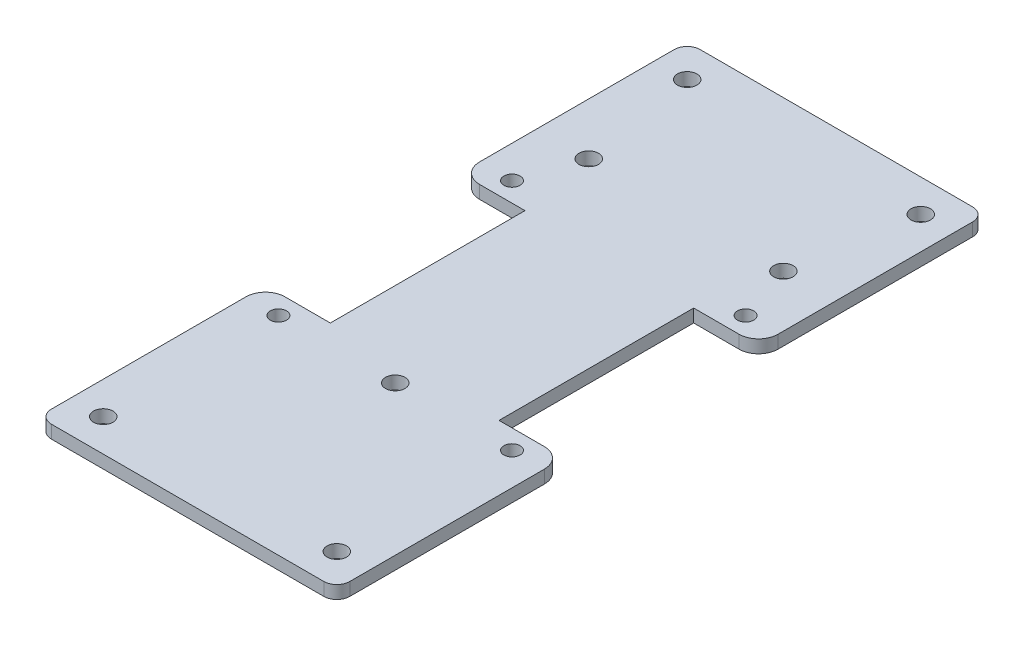
ISO-10303-21;
HEADER;
FILE_DESCRIPTION(('STEP AP214'),'2;1');
FILE_NAME('part.step','',(''),(''),'','','');
FILE_SCHEMA(('AUTOMOTIVE_DESIGN { 1 0 10303 214 1 1 1 1 }'));
ENDSEC;
DATA;
#1=APPLICATION_CONTEXT('core data for automotive mechanical design processes');
#2=APPLICATION_PROTOCOL_DEFINITION('international standard','automotive_design',2000,#1);
#3=PRODUCT_CONTEXT('',#1,'mechanical');
#4=PRODUCT('Part','Part','',(#3));
#5=PRODUCT_RELATED_PRODUCT_CATEGORY('part','',(#4));
#6=PRODUCT_DEFINITION_FORMATION('','',#4);
#7=PRODUCT_DEFINITION_CONTEXT('part definition',#1,'design');
#8=PRODUCT_DEFINITION('design','',#6,#7);
#9=PRODUCT_DEFINITION_SHAPE('','',#8);
#10=(LENGTH_UNIT() NAMED_UNIT(*) SI_UNIT(.MILLI.,.METRE.));
#11=(NAMED_UNIT(*) PLANE_ANGLE_UNIT() SI_UNIT($,.RADIAN.));
#12=(NAMED_UNIT(*) SI_UNIT($,.STERADIAN.) SOLID_ANGLE_UNIT());
#13=UNCERTAINTY_MEASURE_WITH_UNIT(LENGTH_MEASURE(1.E-05),#10,'distance_accuracy_value','');
#14=(GEOMETRIC_REPRESENTATION_CONTEXT(3) GLOBAL_UNCERTAINTY_ASSIGNED_CONTEXT((#13)) GLOBAL_UNIT_ASSIGNED_CONTEXT((#10,
#11,#12)) REPRESENTATION_CONTEXT('',''));
#15=CARTESIAN_POINT('',(0.,0.,0.));
#16=DIRECTION('',(0.,0.,1.));
#17=DIRECTION('',(1.,0.,0.));
#18=AXIS2_PLACEMENT_3D('',#15,#16,#17);
#19=CARTESIAN_POINT('',(-5.,2.,32.));
#20=DIRECTION('',(1.,0.,0.));
#21=DIRECTION('',(0.,0.,-1.));
#22=AXIS2_PLACEMENT_3D('',#19,#20,#21);
#23=PLANE('',#22);
#24=DIRECTION('',(0.,0.,1.));
#25=VECTOR('',#24,1.);
#26=CARTESIAN_POINT('',(-5.,0.,32.));
#27=LINE('',#26,#25);
#28=CARTESIAN_POINT('',(-5.,0.,-66.));
#29=VERTEX_POINT('',#28);
#30=CARTESIAN_POINT('',(-5.,0.,-36.));
#31=VERTEX_POINT('',#30);
#32=EDGE_CURVE('E311',#29,#31,#27,.T.);
#33=ORIENTED_EDGE('',*,*,#32,.T.);
#34=DIRECTION('',(0.,1.,0.));
#35=VECTOR('',#34,1.);
#36=CARTESIAN_POINT('',(-5.,2.,-36.));
#37=LINE('',#36,#35);
#38=CARTESIAN_POINT('',(-5.,2.,-36.));
#39=VERTEX_POINT('',#38);
#40=EDGE_CURVE('E46',#31,#39,#37,.T.);
#41=ORIENTED_EDGE('',*,*,#40,.T.);
#42=DIRECTION('',(0.,0.,1.));
#43=VECTOR('',#42,1.);
#44=CARTESIAN_POINT('',(-5.,2.,32.));
#45=LINE('',#44,#43);
#46=CARTESIAN_POINT('',(-5.,2.,-66.));
#47=VERTEX_POINT('',#46);
#48=EDGE_CURVE('E296',#47,#39,#45,.T.);
#49=ORIENTED_EDGE('',*,*,#48,.F.);
#50=DIRECTION('',(0.,-1.,0.));
#51=VECTOR('',#50,1.);
#52=CARTESIAN_POINT('',(-5.,2.,-66.));
#53=LINE('',#52,#51);
#54=EDGE_CURVE('E338',#47,#29,#53,.T.);
#55=ORIENTED_EDGE('',*,*,#54,.T.);
#56=EDGE_LOOP('',(#33,#41,#49,#55));
#57=FACE_BOUND('',#56,.T.);
#58=ADVANCED_FACE('F38',(#57),#23,.F.);
#59=CARTESIAN_POINT('',(41.,2.,32.));
#60=DIRECTION('',(-1.,0.,0.));
#61=DIRECTION('',(0.,0.,1.));
#62=AXIS2_PLACEMENT_3D('',#59,#60,#61);
#63=PLANE('',#62);
#64=DIRECTION('',(0.,0.,-1.));
#65=VECTOR('',#64,1.);
#66=CARTESIAN_POINT('',(41.,2.,32.));
#67=LINE('',#66,#65);
#68=CARTESIAN_POINT('',(41.,2.,-36.));
#69=VERTEX_POINT('',#68);
#70=CARTESIAN_POINT('',(41.,2.,-66.));
#71=VERTEX_POINT('',#70);
#72=EDGE_CURVE('E303',#69,#71,#67,.T.);
#73=ORIENTED_EDGE('',*,*,#72,.F.);
#74=DIRECTION('',(0.,1.,0.));
#75=VECTOR('',#74,1.);
#76=CARTESIAN_POINT('',(41.,2.,-36.));
#77=LINE('',#76,#75);
#78=CARTESIAN_POINT('',(41.,0.,-36.));
#79=VERTEX_POINT('',#78);
#80=EDGE_CURVE('E374',#69,#79,#77,.F.);
#81=ORIENTED_EDGE('',*,*,#80,.T.);
#82=DIRECTION('',(0.,0.,-1.));
#83=VECTOR('',#82,1.);
#84=CARTESIAN_POINT('',(41.,0.,32.));
#85=LINE('',#84,#83);
#86=CARTESIAN_POINT('',(41.,0.,-66.));
#87=VERTEX_POINT('',#86);
#88=EDGE_CURVE('E317',#79,#87,#85,.T.);
#89=ORIENTED_EDGE('',*,*,#88,.T.);
#90=DIRECTION('',(0.,-1.,0.));
#91=VECTOR('',#90,1.);
#92=CARTESIAN_POINT('',(41.,2.,-66.));
#93=LINE('',#92,#91);
#94=EDGE_CURVE('E352',#87,#71,#93,.F.);
#95=ORIENTED_EDGE('',*,*,#94,.T.);
#96=EDGE_LOOP('',(#73,#81,#89,#95));
#97=FACE_BOUND('',#96,.T.);
#98=ADVANCED_FACE('F427',(#97),#63,.F.);
#99=CARTESIAN_POINT('',(0.,2.,0.));
#100=DIRECTION('',(0.,-1.,0.));
#101=DIRECTION('',(0.,0.,-1.));
#102=AXIS2_PLACEMENT_3D('',#99,#100,#101);
#103=PLANE('',#102);
#104=DIRECTION('',(-1.,0.,0.));
#105=VECTOR('',#104,1.);
#106=CARTESIAN_POINT('',(41.,2.,-33.));
#107=LINE('',#106,#105);
#108=CARTESIAN_POINT('',(38.,2.,-33.));
#109=VERTEX_POINT('',#108);
#110=CARTESIAN_POINT('',(31.,2.,-33.));
#111=VERTEX_POINT('',#110);
#112=EDGE_CURVE('E214',#109,#111,#107,.T.);
#113=ORIENTED_EDGE('',*,*,#112,.F.);
#114=CARTESIAN_POINT('',(38.,2.,-36.));
#115=DIRECTION('',(0.,-1.,0.));
#116=DIRECTION('',(0.,0.,-1.));
#117=AXIS2_PLACEMENT_3D('',#114,#115,#116);
#118=CIRCLE('',#117,3.);
#119=EDGE_CURVE('E372',#109,#69,#118,.F.);
#120=ORIENTED_EDGE('',*,*,#119,.T.);
#121=ORIENTED_EDGE('',*,*,#72,.T.);
#122=CARTESIAN_POINT('',(39.,2.,-66.));
#123=DIRECTION('',(0.,-1.,0.));
#124=DIRECTION('',(0.,0.,-1.));
#125=AXIS2_PLACEMENT_3D('',#122,#123,#124);
#126=CIRCLE('',#125,2.);
#127=CARTESIAN_POINT('',(39.,2.,-68.));
#128=VERTEX_POINT('',#127);
#129=EDGE_CURVE('E344',#71,#128,#126,.F.);
#130=ORIENTED_EDGE('',*,*,#129,.T.);
#131=DIRECTION('',(-1.,0.,0.));
#132=VECTOR('',#131,1.);
#133=CARTESIAN_POINT('',(-5.,2.,-68.));
#134=LINE('',#133,#132);
#135=CARTESIAN_POINT('',(-3.,2.,-68.));
#136=VERTEX_POINT('',#135);
#137=EDGE_CURVE('E307',#128,#136,#134,.T.);
#138=ORIENTED_EDGE('',*,*,#137,.T.);
#139=CARTESIAN_POINT('',(-3.,2.,-66.));
#140=DIRECTION('',(0.,-1.,0.));
#141=DIRECTION('',(0.,0.,-1.));
#142=AXIS2_PLACEMENT_3D('',#139,#140,#141);
#143=CIRCLE('',#142,2.);
#144=EDGE_CURVE('E346',#136,#47,#143,.F.);
#145=ORIENTED_EDGE('',*,*,#144,.T.);
#146=ORIENTED_EDGE('',*,*,#48,.T.);
#147=CARTESIAN_POINT('',(-2.,2.,-36.));
#148=DIRECTION('',(0.,-1.,0.));
#149=DIRECTION('',(0.,0.,-1.));
#150=AXIS2_PLACEMENT_3D('',#147,#148,#149);
#151=CIRCLE('',#150,3.);
#152=CARTESIAN_POINT('',(-2.,2.,-33.));
#153=VERTEX_POINT('',#152);
#154=EDGE_CURVE('E366',#39,#153,#151,.F.);
#155=ORIENTED_EDGE('',*,*,#154,.T.);
#156=DIRECTION('',(-1.,0.,0.));
#157=VECTOR('',#156,1.);
#158=CARTESIAN_POINT('',(-5.,2.,-33.));
#159=LINE('',#158,#157);
#160=CARTESIAN_POINT('',(5.,2.,-33.));
#161=VERTEX_POINT('',#160);
#162=EDGE_CURVE('E184',#161,#153,#159,.T.);
#163=ORIENTED_EDGE('',*,*,#162,.F.);
#164=DIRECTION('',(0.,0.,-1.));
#165=VECTOR('',#164,1.);
#166=CARTESIAN_POINT('',(5.,2.,-33.));
#167=LINE('',#166,#165);
#168=CARTESIAN_POINT('',(5.,2.,-3.));
#169=VERTEX_POINT('',#168);
#170=EDGE_CURVE('E203',#169,#161,#167,.T.);
#171=ORIENTED_EDGE('',*,*,#170,.F.);
#172=DIRECTION('',(1.,0.,0.));
#173=VECTOR('',#172,1.);
#174=CARTESIAN_POINT('',(5.,2.,-3.));
#175=LINE('',#174,#173);
#176=CARTESIAN_POINT('',(-2.,2.,-3.));
#177=VERTEX_POINT('',#176);
#178=EDGE_CURVE('E190',#177,#169,#175,.T.);
#179=ORIENTED_EDGE('',*,*,#178,.F.);
#180=CARTESIAN_POINT('',(-2.,2.,0.));
#181=DIRECTION('',(0.,-1.,0.));
#182=DIRECTION('',(0.,0.,-1.));
#183=AXIS2_PLACEMENT_3D('',#180,#181,#182);
#184=CIRCLE('',#183,3.);
#185=CARTESIAN_POINT('',(-5.,2.,0.));
#186=VERTEX_POINT('',#185);
#187=EDGE_CURVE('E368',#177,#186,#184,.F.);
#188=ORIENTED_EDGE('',*,*,#187,.T.);
#189=CARTESIAN_POINT('',(-5.,2.,30.));
#190=VERTEX_POINT('',#189);
#191=EDGE_CURVE('E300',#186,#190,#45,.T.);
#192=ORIENTED_EDGE('',*,*,#191,.T.);
#193=CARTESIAN_POINT('',(-3.,2.,30.));
#194=DIRECTION('',(0.,-1.,0.));
#195=DIRECTION('',(0.,0.,-1.));
#196=AXIS2_PLACEMENT_3D('',#193,#194,#195);
#197=CIRCLE('',#196,2.);
#198=CARTESIAN_POINT('',(-3.,2.,32.));
#199=VERTEX_POINT('',#198);
#200=EDGE_CURVE('E350',#190,#199,#197,.F.);
#201=ORIENTED_EDGE('',*,*,#200,.T.);
#202=DIRECTION('',(1.,0.,0.));
#203=VECTOR('',#202,1.);
#204=CARTESIAN_POINT('',(-5.,2.,32.));
#205=LINE('',#204,#203);
#206=CARTESIAN_POINT('',(39.,2.,32.));
#207=VERTEX_POINT('',#206);
#208=EDGE_CURVE('E299',#199,#207,#205,.T.);
#209=ORIENTED_EDGE('',*,*,#208,.T.);
#210=CARTESIAN_POINT('',(39.,2.,30.));
#211=DIRECTION('',(0.,-1.,0.));
#212=DIRECTION('',(0.,0.,-1.));
#213=AXIS2_PLACEMENT_3D('',#210,#211,#212);
#214=CIRCLE('',#213,2.);
#215=CARTESIAN_POINT('',(41.,2.,30.));
#216=VERTEX_POINT('',#215);
#217=EDGE_CURVE('E348',#207,#216,#214,.F.);
#218=ORIENTED_EDGE('',*,*,#217,.T.);
#219=CARTESIAN_POINT('',(41.,2.,0.));
#220=VERTEX_POINT('',#219);
#221=EDGE_CURVE('E304',#216,#220,#67,.T.);
#222=ORIENTED_EDGE('',*,*,#221,.T.);
#223=CARTESIAN_POINT('',(38.,2.,0.));
#224=DIRECTION('',(0.,-1.,0.));
#225=DIRECTION('',(0.,0.,-1.));
#226=AXIS2_PLACEMENT_3D('',#223,#224,#225);
#227=CIRCLE('',#226,3.);
#228=CARTESIAN_POINT('',(38.,2.,-3.00000000000001));
#229=VERTEX_POINT('',#228);
#230=EDGE_CURVE('E370',#220,#229,#227,.F.);
#231=ORIENTED_EDGE('',*,*,#230,.T.);
#232=DIRECTION('',(1.,0.,0.));
#233=VECTOR('',#232,1.);
#234=CARTESIAN_POINT('',(31.,2.,-3.00000000000001));
#235=LINE('',#234,#233);
#236=CARTESIAN_POINT('',(31.,2.,-3.00000000000001));
#237=VERTEX_POINT('',#236);
#238=EDGE_CURVE('E223',#237,#229,#235,.T.);
#239=ORIENTED_EDGE('',*,*,#238,.F.);
#240=DIRECTION('',(0.,0.,1.));
#241=VECTOR('',#240,1.);
#242=CARTESIAN_POINT('',(31.,2.,-33.));
#243=LINE('',#242,#241);
#244=EDGE_CURVE('E220',#111,#237,#243,.T.);
#245=ORIENTED_EDGE('',*,*,#244,.F.);
#246=EDGE_LOOP('',(#113,#120,#121,#130,#138,#145,#146,#155,#163,#171,#179,#188,#192,#201,#209,
#218,#222,#231,#239,#245));
#247=FACE_BOUND('',#246,.T.);
#248=CARTESIAN_POINT('',(0.,2.,-36.));
#249=DIRECTION('',(0.,1.,0.));
#250=DIRECTION('',(0.,0.,1.));
#251=AXIS2_PLACEMENT_3D('',#248,#249,#250);
#252=CIRCLE('',#251,1.25);
#253=CARTESIAN_POINT('',(0.,2.,-34.75));
#254=VERTEX_POINT('',#253);
#255=EDGE_CURVE('E290',#254,#254,#252,.T.);
#256=ORIENTED_EDGE('',*,*,#255,.F.);
#257=EDGE_LOOP('',(#256));
#258=FACE_BOUND('',#257,.T.);
#259=CARTESIAN_POINT('',(36.,2.,-36.));
#260=DIRECTION('',(0.,1.,0.));
#261=DIRECTION('',(0.,0.,1.));
#262=AXIS2_PLACEMENT_3D('',#259,#260,#261);
#263=CIRCLE('',#262,1.25);
#264=CARTESIAN_POINT('',(36.,2.,-34.75));
#265=VERTEX_POINT('',#264);
#266=EDGE_CURVE('E284',#265,#265,#263,.T.);
#267=ORIENTED_EDGE('',*,*,#266,.F.);
#268=EDGE_LOOP('',(#267));
#269=FACE_BOUND('',#268,.T.);
#270=CARTESIAN_POINT('',(0.,2.,0.));
#271=DIRECTION('',(0.,1.,0.));
#272=DIRECTION('',(0.,0.,1.));
#273=AXIS2_PLACEMENT_3D('',#270,#271,#272);
#274=CIRCLE('',#273,1.25);
#275=CARTESIAN_POINT('',(0.,2.,1.25));
#276=VERTEX_POINT('',#275);
#277=EDGE_CURVE('E278',#276,#276,#274,.T.);
#278=ORIENTED_EDGE('',*,*,#277,.F.);
#279=EDGE_LOOP('',(#278));
#280=FACE_BOUND('',#279,.T.);
#281=CARTESIAN_POINT('',(36.,2.,0.));
#282=DIRECTION('',(0.,1.,0.));
#283=DIRECTION('',(0.,0.,1.));
#284=AXIS2_PLACEMENT_3D('',#281,#282,#283);
#285=CIRCLE('',#284,1.25);
#286=CARTESIAN_POINT('',(36.,2.,1.25));
#287=VERTEX_POINT('',#286);
#288=EDGE_CURVE('E272',#287,#287,#285,.T.);
#289=ORIENTED_EDGE('',*,*,#288,.F.);
#290=EDGE_LOOP('',(#289));
#291=FACE_BOUND('',#290,.T.);
#292=CARTESIAN_POINT('',(0.,2.,-63.));
#293=DIRECTION('',(0.,1.,0.));
#294=DIRECTION('',(0.,0.,1.));
#295=AXIS2_PLACEMENT_3D('',#292,#293,#294);
#296=CIRCLE('',#295,1.5);
#297=CARTESIAN_POINT('',(0.,2.,-61.5));
#298=VERTEX_POINT('',#297);
#299=EDGE_CURVE('E266',#298,#298,#296,.T.);
#300=ORIENTED_EDGE('',*,*,#299,.F.);
#301=EDGE_LOOP('',(#300));
#302=FACE_BOUND('',#301,.T.);
#303=CARTESIAN_POINT('',(36.,2.,-63.));
#304=DIRECTION('',(0.,1.,0.));
#305=DIRECTION('',(0.,0.,1.));
#306=AXIS2_PLACEMENT_3D('',#303,#304,#305);
#307=CIRCLE('',#306,1.5);
#308=CARTESIAN_POINT('',(36.,2.,-61.5));
#309=VERTEX_POINT('',#308);
#310=EDGE_CURVE('E260',#309,#309,#307,.T.);
#311=ORIENTED_EDGE('',*,*,#310,.F.);
#312=EDGE_LOOP('',(#311));
#313=FACE_BOUND('',#312,.T.);
#314=CARTESIAN_POINT('',(36.,2.,27.));
#315=DIRECTION('',(0.,1.,0.));
#316=DIRECTION('',(0.,0.,-1.));
#317=AXIS2_PLACEMENT_3D('',#314,#315,#316);
#318=CIRCLE('',#317,1.5);
#319=CARTESIAN_POINT('',(36.,2.,25.5));
#320=VERTEX_POINT('',#319);
#321=EDGE_CURVE('E254',#320,#320,#318,.T.);
#322=ORIENTED_EDGE('',*,*,#321,.F.);
#323=EDGE_LOOP('',(#322));
#324=FACE_BOUND('',#323,.T.);
#325=CARTESIAN_POINT('',(0.,2.,27.));
#326=DIRECTION('',(0.,1.,0.));
#327=DIRECTION('',(0.,0.,-1.));
#328=AXIS2_PLACEMENT_3D('',#325,#326,#327);
#329=CIRCLE('',#328,1.5);
#330=CARTESIAN_POINT('',(0.,2.,25.5));
#331=VERTEX_POINT('',#330);
#332=EDGE_CURVE('E248',#331,#331,#329,.T.);
#333=ORIENTED_EDGE('',*,*,#332,.F.);
#334=EDGE_LOOP('',(#333));
#335=FACE_BOUND('',#334,.T.);
#336=CARTESIAN_POINT('',(3.,2.,-44.83));
#337=DIRECTION('',(0.,1.,0.));
#338=DIRECTION('',(0.,0.,1.));
#339=AXIS2_PLACEMENT_3D('',#336,#337,#338);
#340=CIRCLE('',#339,1.5);
#341=CARTESIAN_POINT('',(3.,2.,-43.33));
#342=VERTEX_POINT('',#341);
#343=EDGE_CURVE('E242',#342,#342,#340,.T.);
#344=ORIENTED_EDGE('',*,*,#343,.F.);
#345=EDGE_LOOP('',(#344));
#346=FACE_BOUND('',#345,.T.);
#347=CARTESIAN_POINT('',(33.,2.,-44.83));
#348=DIRECTION('',(0.,1.,0.));
#349=DIRECTION('',(0.,0.,1.));
#350=AXIS2_PLACEMENT_3D('',#347,#348,#349);
#351=CIRCLE('',#350,1.5);
#352=CARTESIAN_POINT('',(33.,2.,-43.33));
#353=VERTEX_POINT('',#352);
#354=EDGE_CURVE('E236',#353,#353,#351,.T.);
#355=ORIENTED_EDGE('',*,*,#354,.F.);
#356=EDGE_LOOP('',(#355));
#357=FACE_BOUND('',#356,.T.);
#358=CARTESIAN_POINT('',(18.,2.,0.));
#359=DIRECTION('',(0.,1.,0.));
#360=DIRECTION('',(0.,0.,1.));
#361=AXIS2_PLACEMENT_3D('',#358,#359,#360);
#362=CIRCLE('',#361,1.5);
#363=CARTESIAN_POINT('',(18.,2.,1.5));
#364=VERTEX_POINT('',#363);
#365=EDGE_CURVE('E230',#364,#364,#362,.T.);
#366=ORIENTED_EDGE('',*,*,#365,.F.);
#367=EDGE_LOOP('',(#366));
#368=FACE_BOUND('',#367,.T.);
#369=ADVANCED_FACE('F400',(#247,#258,#269,#280,#291,#302,#313,#324,#335,#346,#357,#368),#103,.F.);
#370=CARTESIAN_POINT('',(0.,0.,0.));
#371=DIRECTION('',(0.,-1.,0.));
#372=DIRECTION('',(0.,0.,-1.));
#373=AXIS2_PLACEMENT_3D('',#370,#371,#372);
#374=PLANE('',#373);
#375=ORIENTED_EDGE('',*,*,#88,.F.);
#376=CARTESIAN_POINT('',(38.,0.,-36.));
#377=DIRECTION('',(0.,-1.,0.));
#378=DIRECTION('',(0.,0.,-1.));
#379=AXIS2_PLACEMENT_3D('',#376,#377,#378);
#380=CIRCLE('',#379,3.);
#381=CARTESIAN_POINT('',(38.,0.,-33.));
#382=VERTEX_POINT('',#381);
#383=EDGE_CURVE('E381',#79,#382,#380,.T.);
#384=ORIENTED_EDGE('',*,*,#383,.T.);
#385=DIRECTION('',(-1.,0.,0.));
#386=VECTOR('',#385,1.);
#387=CARTESIAN_POINT('',(41.,0.,-33.));
#388=LINE('',#387,#386);
#389=CARTESIAN_POINT('',(31.,0.,-33.));
#390=VERTEX_POINT('',#389);
#391=EDGE_CURVE('E217',#382,#390,#388,.T.);
#392=ORIENTED_EDGE('',*,*,#391,.T.);
#393=DIRECTION('',(0.,0.,1.));
#394=VECTOR('',#393,1.);
#395=CARTESIAN_POINT('',(31.,0.,-33.));
#396=LINE('',#395,#394);
#397=CARTESIAN_POINT('',(31.,0.,-3.00000000000001));
#398=VERTEX_POINT('',#397);
#399=EDGE_CURVE('E210',#390,#398,#396,.T.);
#400=ORIENTED_EDGE('',*,*,#399,.T.);
#401=DIRECTION('',(1.,0.,0.));
#402=VECTOR('',#401,1.);
#403=CARTESIAN_POINT('',(31.,0.,-3.00000000000001));
#404=LINE('',#403,#402);
#405=CARTESIAN_POINT('',(38.,0.,-3.00000000000001));
#406=VERTEX_POINT('',#405);
#407=EDGE_CURVE('E213',#398,#406,#404,.T.);
#408=ORIENTED_EDGE('',*,*,#407,.T.);
#409=CARTESIAN_POINT('',(38.,0.,0.));
#410=DIRECTION('',(0.,-1.,0.));
#411=DIRECTION('',(0.,0.,-1.));
#412=AXIS2_PLACEMENT_3D('',#409,#410,#411);
#413=CIRCLE('',#412,3.);
#414=CARTESIAN_POINT('',(41.,0.,0.));
#415=VERTEX_POINT('',#414);
#416=EDGE_CURVE('E379',#406,#415,#413,.T.);
#417=ORIENTED_EDGE('',*,*,#416,.T.);
#418=CARTESIAN_POINT('',(41.,0.,30.));
#419=VERTEX_POINT('',#418);
#420=EDGE_CURVE('E318',#419,#415,#85,.T.);
#421=ORIENTED_EDGE('',*,*,#420,.F.);
#422=CARTESIAN_POINT('',(39.,0.,30.));
#423=DIRECTION('',(0.,-1.,0.));
#424=DIRECTION('',(0.,0.,-1.));
#425=AXIS2_PLACEMENT_3D('',#422,#423,#424);
#426=CIRCLE('',#425,2.);
#427=CARTESIAN_POINT('',(39.,0.,32.));
#428=VERTEX_POINT('',#427);
#429=EDGE_CURVE('E333',#419,#428,#426,.T.);
#430=ORIENTED_EDGE('',*,*,#429,.T.);
#431=DIRECTION('',(1.,0.,0.));
#432=VECTOR('',#431,1.);
#433=CARTESIAN_POINT('',(-5.,0.,32.));
#434=LINE('',#433,#432);
#435=CARTESIAN_POINT('',(-3.,0.,32.));
#436=VERTEX_POINT('',#435);
#437=EDGE_CURVE('E314',#436,#428,#434,.T.);
#438=ORIENTED_EDGE('',*,*,#437,.F.);
#439=CARTESIAN_POINT('',(-3.,0.,30.));
#440=DIRECTION('',(0.,-1.,0.));
#441=DIRECTION('',(0.,0.,-1.));
#442=AXIS2_PLACEMENT_3D('',#439,#440,#441);
#443=CIRCLE('',#442,2.);
#444=CARTESIAN_POINT('',(-5.,0.,30.));
#445=VERTEX_POINT('',#444);
#446=EDGE_CURVE('E335',#436,#445,#443,.T.);
#447=ORIENTED_EDGE('',*,*,#446,.T.);
#448=CARTESIAN_POINT('',(-5.,0.,0.));
#449=VERTEX_POINT('',#448);
#450=EDGE_CURVE('E293',#449,#445,#27,.T.);
#451=ORIENTED_EDGE('',*,*,#450,.F.);
#452=CARTESIAN_POINT('',(-2.,0.,0.));
#453=DIRECTION('',(0.,-1.,0.));
#454=DIRECTION('',(0.,0.,-1.));
#455=AXIS2_PLACEMENT_3D('',#452,#453,#454);
#456=CIRCLE('',#455,3.);
#457=CARTESIAN_POINT('',(-2.,0.,-3.));
#458=VERTEX_POINT('',#457);
#459=EDGE_CURVE('E53',#449,#458,#456,.T.);
#460=ORIENTED_EDGE('',*,*,#459,.T.);
#461=DIRECTION('',(1.,0.,0.));
#462=VECTOR('',#461,1.);
#463=CARTESIAN_POINT('',(5.,0.,-3.));
#464=LINE('',#463,#462);
#465=CARTESIAN_POINT('',(5.,0.,-3.));
#466=VERTEX_POINT('',#465);
#467=EDGE_CURVE('E173',#458,#466,#464,.T.);
#468=ORIENTED_EDGE('',*,*,#467,.T.);
#469=DIRECTION('',(0.,0.,-1.));
#470=VECTOR('',#469,1.);
#471=CARTESIAN_POINT('',(5.,0.,-33.));
#472=LINE('',#471,#470);
#473=CARTESIAN_POINT('',(5.,0.,-33.));
#474=VERTEX_POINT('',#473);
#475=EDGE_CURVE('E180',#466,#474,#472,.T.);
#476=ORIENTED_EDGE('',*,*,#475,.T.);
#477=DIRECTION('',(-1.,0.,0.));
#478=VECTOR('',#477,1.);
#479=CARTESIAN_POINT('',(-5.,0.,-33.));
#480=LINE('',#479,#478);
#481=CARTESIAN_POINT('',(-2.,0.,-33.));
#482=VERTEX_POINT('',#481);
#483=EDGE_CURVE('E195',#474,#482,#480,.T.);
#484=ORIENTED_EDGE('',*,*,#483,.T.);
#485=CARTESIAN_POINT('',(-2.,0.,-36.));
#486=DIRECTION('',(0.,-1.,0.));
#487=DIRECTION('',(0.,0.,-1.));
#488=AXIS2_PLACEMENT_3D('',#485,#486,#487);
#489=CIRCLE('',#488,3.);
#490=EDGE_CURVE('E376',#482,#31,#489,.T.);
#491=ORIENTED_EDGE('',*,*,#490,.T.);
#492=ORIENTED_EDGE('',*,*,#32,.F.);
#493=CARTESIAN_POINT('',(-3.,0.,-66.));
#494=DIRECTION('',(0.,-1.,0.));
#495=DIRECTION('',(0.,0.,-1.));
#496=AXIS2_PLACEMENT_3D('',#493,#494,#495);
#497=CIRCLE('',#496,2.);
#498=CARTESIAN_POINT('',(-3.,0.,-68.));
#499=VERTEX_POINT('',#498);
#500=EDGE_CURVE('E331',#29,#499,#497,.T.);
#501=ORIENTED_EDGE('',*,*,#500,.T.);
#502=DIRECTION('',(-1.,0.,0.));
#503=VECTOR('',#502,1.);
#504=CARTESIAN_POINT('',(-5.,0.,-68.));
#505=LINE('',#504,#503);
#506=CARTESIAN_POINT('',(39.,0.,-68.));
#507=VERTEX_POINT('',#506);
#508=EDGE_CURVE('E321',#507,#499,#505,.T.);
#509=ORIENTED_EDGE('',*,*,#508,.F.);
#510=CARTESIAN_POINT('',(39.,0.,-66.));
#511=DIRECTION('',(0.,-1.,0.));
#512=DIRECTION('',(0.,0.,-1.));
#513=AXIS2_PLACEMENT_3D('',#510,#511,#512);
#514=CIRCLE('',#513,2.);
#515=EDGE_CURVE('E328',#507,#87,#514,.T.);
#516=ORIENTED_EDGE('',*,*,#515,.T.);
#517=EDGE_LOOP('',(#375,#384,#392,#400,#408,#417,#421,#430,#438,#447,#451,#460,#468,#476,#484,
#491,#492,#501,#509,#516));
#518=FACE_BOUND('',#517,.T.);
#519=CARTESIAN_POINT('',(33.,0.,-44.83));
#520=DIRECTION('',(0.,1.,0.));
#521=DIRECTION('',(0.,0.,1.));
#522=AXIS2_PLACEMENT_3D('',#519,#520,#521);
#523=CIRCLE('',#522,1.5);
#524=CARTESIAN_POINT('',(33.,0.,-43.33));
#525=VERTEX_POINT('',#524);
#526=EDGE_CURVE('E233',#525,#525,#523,.T.);
#527=ORIENTED_EDGE('',*,*,#526,.T.);
#528=EDGE_LOOP('',(#527));
#529=FACE_BOUND('',#528,.T.);
#530=CARTESIAN_POINT('',(0.,0.,27.));
#531=DIRECTION('',(0.,1.,0.));
#532=DIRECTION('',(0.,0.,-1.));
#533=AXIS2_PLACEMENT_3D('',#530,#531,#532);
#534=CIRCLE('',#533,1.5);
#535=CARTESIAN_POINT('',(0.,0.,25.5));
#536=VERTEX_POINT('',#535);
#537=EDGE_CURVE('E245',#536,#536,#534,.T.);
#538=ORIENTED_EDGE('',*,*,#537,.T.);
#539=EDGE_LOOP('',(#538));
#540=FACE_BOUND('',#539,.T.);
#541=CARTESIAN_POINT('',(36.,0.,-63.));
#542=DIRECTION('',(0.,1.,0.));
#543=DIRECTION('',(0.,0.,1.));
#544=AXIS2_PLACEMENT_3D('',#541,#542,#543);
#545=CIRCLE('',#544,1.5);
#546=CARTESIAN_POINT('',(36.,0.,-61.5));
#547=VERTEX_POINT('',#546);
#548=EDGE_CURVE('E257',#547,#547,#545,.T.);
#549=ORIENTED_EDGE('',*,*,#548,.T.);
#550=EDGE_LOOP('',(#549));
#551=FACE_BOUND('',#550,.T.);
#552=CARTESIAN_POINT('',(36.,0.,0.));
#553=DIRECTION('',(0.,1.,0.));
#554=DIRECTION('',(0.,0.,1.));
#555=AXIS2_PLACEMENT_3D('',#552,#553,#554);
#556=CIRCLE('',#555,1.25);
#557=CARTESIAN_POINT('',(36.,0.,1.25));
#558=VERTEX_POINT('',#557);
#559=EDGE_CURVE('E269',#558,#558,#556,.T.);
#560=ORIENTED_EDGE('',*,*,#559,.T.);
#561=EDGE_LOOP('',(#560));
#562=FACE_BOUND('',#561,.T.);
#563=CARTESIAN_POINT('',(36.,0.,-36.));
#564=DIRECTION('',(0.,1.,0.));
#565=DIRECTION('',(0.,0.,1.));
#566=AXIS2_PLACEMENT_3D('',#563,#564,#565);
#567=CIRCLE('',#566,1.25);
#568=CARTESIAN_POINT('',(36.,0.,-34.75));
#569=VERTEX_POINT('',#568);
#570=EDGE_CURVE('E281',#569,#569,#567,.T.);
#571=ORIENTED_EDGE('',*,*,#570,.T.);
#572=EDGE_LOOP('',(#571));
#573=FACE_BOUND('',#572,.T.);
#574=CARTESIAN_POINT('',(0.,0.,-36.));
#575=DIRECTION('',(0.,1.,0.));
#576=DIRECTION('',(0.,0.,1.));
#577=AXIS2_PLACEMENT_3D('',#574,#575,#576);
#578=CIRCLE('',#577,1.25);
#579=CARTESIAN_POINT('',(0.,0.,-34.75));
#580=VERTEX_POINT('',#579);
#581=EDGE_CURVE('E287',#580,#580,#578,.T.);
#582=ORIENTED_EDGE('',*,*,#581,.T.);
#583=EDGE_LOOP('',(#582));
#584=FACE_BOUND('',#583,.T.);
#585=CARTESIAN_POINT('',(0.,0.,0.));
#586=DIRECTION('',(0.,1.,0.));
#587=DIRECTION('',(0.,0.,1.));
#588=AXIS2_PLACEMENT_3D('',#585,#586,#587);
#589=CIRCLE('',#588,1.25);
#590=CARTESIAN_POINT('',(0.,0.,1.25));
#591=VERTEX_POINT('',#590);
#592=EDGE_CURVE('E275',#591,#591,#589,.T.);
#593=ORIENTED_EDGE('',*,*,#592,.T.);
#594=EDGE_LOOP('',(#593));
#595=FACE_BOUND('',#594,.T.);
#596=CARTESIAN_POINT('',(0.,0.,-63.));
#597=DIRECTION('',(0.,1.,0.));
#598=DIRECTION('',(0.,0.,1.));
#599=AXIS2_PLACEMENT_3D('',#596,#597,#598);
#600=CIRCLE('',#599,1.5);
#601=CARTESIAN_POINT('',(0.,0.,-61.5));
#602=VERTEX_POINT('',#601);
#603=EDGE_CURVE('E263',#602,#602,#600,.T.);
#604=ORIENTED_EDGE('',*,*,#603,.T.);
#605=EDGE_LOOP('',(#604));
#606=FACE_BOUND('',#605,.T.);
#607=CARTESIAN_POINT('',(36.,0.,27.));
#608=DIRECTION('',(0.,1.,0.));
#609=DIRECTION('',(0.,0.,-1.));
#610=AXIS2_PLACEMENT_3D('',#607,#608,#609);
#611=CIRCLE('',#610,1.5);
#612=CARTESIAN_POINT('',(36.,0.,25.5));
#613=VERTEX_POINT('',#612);
#614=EDGE_CURVE('E251',#613,#613,#611,.T.);
#615=ORIENTED_EDGE('',*,*,#614,.T.);
#616=EDGE_LOOP('',(#615));
#617=FACE_BOUND('',#616,.T.);
#618=CARTESIAN_POINT('',(3.,0.,-44.83));
#619=DIRECTION('',(0.,1.,0.));
#620=DIRECTION('',(0.,0.,1.));
#621=AXIS2_PLACEMENT_3D('',#618,#619,#620);
#622=CIRCLE('',#621,1.5);
#623=CARTESIAN_POINT('',(3.,0.,-43.33));
#624=VERTEX_POINT('',#623);
#625=EDGE_CURVE('E239',#624,#624,#622,.T.);
#626=ORIENTED_EDGE('',*,*,#625,.T.);
#627=EDGE_LOOP('',(#626));
#628=FACE_BOUND('',#627,.T.);
#629=CARTESIAN_POINT('',(18.,0.,0.));
#630=DIRECTION('',(0.,1.,0.));
#631=DIRECTION('',(0.,0.,1.));
#632=AXIS2_PLACEMENT_3D('',#629,#630,#631);
#633=CIRCLE('',#632,1.5);
#634=CARTESIAN_POINT('',(18.,0.,1.5));
#635=VERTEX_POINT('',#634);
#636=EDGE_CURVE('E208',#635,#635,#633,.T.);
#637=ORIENTED_EDGE('',*,*,#636,.T.);
#638=EDGE_LOOP('',(#637));
#639=FACE_BOUND('',#638,.T.);
#640=ADVANCED_FACE('F176',(#518,#529,#540,#551,#562,#573,#584,#595,#606,#617,#628,#639),#374,.T.);
#641=ORIENTED_EDGE('',*,*,#191,.F.);
#642=DIRECTION('',(0.,1.,0.));
#643=VECTOR('',#642,1.);
#644=CARTESIAN_POINT('',(-5.,2.,0.));
#645=LINE('',#644,#643);
#646=EDGE_CURVE('E61',#186,#449,#645,.F.);
#647=ORIENTED_EDGE('',*,*,#646,.T.);
#648=ORIENTED_EDGE('',*,*,#450,.T.);
#649=DIRECTION('',(0.,-1.,0.));
#650=VECTOR('',#649,1.);
#651=CARTESIAN_POINT('',(-5.,2.,30.));
#652=LINE('',#651,#650);
#653=EDGE_CURVE('E341',#445,#190,#652,.F.);
#654=ORIENTED_EDGE('',*,*,#653,.T.);
#655=EDGE_LOOP('',(#641,#647,#648,#654));
#656=FACE_BOUND('',#655,.T.);
#657=ADVANCED_FACE('F413',(#656),#23,.F.);
#658=CARTESIAN_POINT('',(-5.,2.,32.));
#659=DIRECTION('',(0.,0.,-1.));
#660=DIRECTION('',(-1.,0.,0.));
#661=AXIS2_PLACEMENT_3D('',#658,#659,#660);
#662=PLANE('',#661);
#663=ORIENTED_EDGE('',*,*,#208,.F.);
#664=DIRECTION('',(0.,-1.,0.));
#665=VECTOR('',#664,1.);
#666=CARTESIAN_POINT('',(-3.,2.,32.));
#667=LINE('',#666,#665);
#668=EDGE_CURVE('E325',#199,#436,#667,.T.);
#669=ORIENTED_EDGE('',*,*,#668,.T.);
#670=ORIENTED_EDGE('',*,*,#437,.T.);
#671=DIRECTION('',(0.,-1.,0.));
#672=VECTOR('',#671,1.);
#673=CARTESIAN_POINT('',(39.,2.,32.));
#674=LINE('',#673,#672);
#675=EDGE_CURVE('E310',#428,#207,#674,.F.);
#676=ORIENTED_EDGE('',*,*,#675,.T.);
#677=EDGE_LOOP('',(#663,#669,#670,#676));
#678=FACE_BOUND('',#677,.T.);
#679=ADVANCED_FACE('F438',(#678),#662,.F.);
#680=ORIENTED_EDGE('',*,*,#420,.T.);
#681=DIRECTION('',(0.,1.,0.));
#682=VECTOR('',#681,1.);
#683=CARTESIAN_POINT('',(41.,2.,0.));
#684=LINE('',#683,#682);
#685=EDGE_CURVE('E383',#415,#220,#684,.T.);
#686=ORIENTED_EDGE('',*,*,#685,.T.);
#687=ORIENTED_EDGE('',*,*,#221,.F.);
#688=DIRECTION('',(0.,-1.,0.));
#689=VECTOR('',#688,1.);
#690=CARTESIAN_POINT('',(41.,2.,30.));
#691=LINE('',#690,#689);
#692=EDGE_CURVE('E355',#216,#419,#691,.T.);
#693=ORIENTED_EDGE('',*,*,#692,.T.);
#694=EDGE_LOOP('',(#680,#686,#687,#693));
#695=FACE_BOUND('',#694,.T.);
#696=ADVANCED_FACE('F434',(#695),#63,.F.);
#697=CARTESIAN_POINT('',(-5.,2.,-68.));
#698=DIRECTION('',(0.,0.,1.));
#699=DIRECTION('',(1.,0.,0.));
#700=AXIS2_PLACEMENT_3D('',#697,#698,#699);
#701=PLANE('',#700);
#702=ORIENTED_EDGE('',*,*,#508,.T.);
#703=DIRECTION('',(0.,-1.,0.));
#704=VECTOR('',#703,1.);
#705=CARTESIAN_POINT('',(-3.,2.,-68.));
#706=LINE('',#705,#704);
#707=EDGE_CURVE('E361',#499,#136,#706,.F.);
#708=ORIENTED_EDGE('',*,*,#707,.T.);
#709=ORIENTED_EDGE('',*,*,#137,.F.);
#710=DIRECTION('',(0.,-1.,0.));
#711=VECTOR('',#710,1.);
#712=CARTESIAN_POINT('',(39.,2.,-68.));
#713=LINE('',#712,#711);
#714=EDGE_CURVE('E358',#128,#507,#713,.T.);
#715=ORIENTED_EDGE('',*,*,#714,.T.);
#716=EDGE_LOOP('',(#702,#708,#709,#715));
#717=FACE_BOUND('',#716,.T.);
#718=ADVANCED_FACE('F451',(#717),#701,.F.);
#719=CARTESIAN_POINT('',(0.,2.,-36.));
#720=DIRECTION('',(0.,-1.,0.));
#721=DIRECTION('',(0.,0.,-1.));
#722=AXIS2_PLACEMENT_3D('',#719,#720,#721);
#723=CYLINDRICAL_SURFACE('',#722,1.25);
#724=ORIENTED_EDGE('',*,*,#255,.T.);
#725=EDGE_LOOP('',(#724));
#726=FACE_BOUND('',#725,.T.);
#727=ORIENTED_EDGE('',*,*,#581,.F.);
#728=EDGE_LOOP('',(#727));
#729=FACE_BOUND('',#728,.T.);
#730=ADVANCED_FACE('F453',(#726,#729),#723,.F.);
#731=CARTESIAN_POINT('',(36.,2.,-36.));
#732=DIRECTION('',(0.,-1.,0.));
#733=DIRECTION('',(0.,0.,-1.));
#734=AXIS2_PLACEMENT_3D('',#731,#732,#733);
#735=CYLINDRICAL_SURFACE('',#734,1.25);
#736=ORIENTED_EDGE('',*,*,#266,.T.);
#737=EDGE_LOOP('',(#736));
#738=FACE_BOUND('',#737,.T.);
#739=ORIENTED_EDGE('',*,*,#570,.F.);
#740=EDGE_LOOP('',(#739));
#741=FACE_BOUND('',#740,.T.);
#742=ADVANCED_FACE('F549',(#738,#741),#735,.F.);
#743=CARTESIAN_POINT('',(0.,2.,0.));
#744=DIRECTION('',(0.,-1.,0.));
#745=DIRECTION('',(0.,0.,-1.));
#746=AXIS2_PLACEMENT_3D('',#743,#744,#745);
#747=CYLINDRICAL_SURFACE('',#746,1.25);
#748=ORIENTED_EDGE('',*,*,#277,.T.);
#749=EDGE_LOOP('',(#748));
#750=FACE_BOUND('',#749,.T.);
#751=ORIENTED_EDGE('',*,*,#592,.F.);
#752=EDGE_LOOP('',(#751));
#753=FACE_BOUND('',#752,.T.);
#754=ADVANCED_FACE('F545',(#750,#753),#747,.F.);
#755=CARTESIAN_POINT('',(36.,2.,0.));
#756=DIRECTION('',(0.,-1.,0.));
#757=DIRECTION('',(0.,0.,-1.));
#758=AXIS2_PLACEMENT_3D('',#755,#756,#757);
#759=CYLINDRICAL_SURFACE('',#758,1.25);
#760=ORIENTED_EDGE('',*,*,#288,.T.);
#761=EDGE_LOOP('',(#760));
#762=FACE_BOUND('',#761,.T.);
#763=ORIENTED_EDGE('',*,*,#559,.F.);
#764=EDGE_LOOP('',(#763));
#765=FACE_BOUND('',#764,.T.);
#766=ADVANCED_FACE('F541',(#762,#765),#759,.F.);
#767=CARTESIAN_POINT('',(0.,2.,-63.));
#768=DIRECTION('',(0.,-1.,0.));
#769=DIRECTION('',(0.,0.,-1.));
#770=AXIS2_PLACEMENT_3D('',#767,#768,#769);
#771=CYLINDRICAL_SURFACE('',#770,1.5);
#772=ORIENTED_EDGE('',*,*,#299,.T.);
#773=EDGE_LOOP('',(#772));
#774=FACE_BOUND('',#773,.T.);
#775=ORIENTED_EDGE('',*,*,#603,.F.);
#776=EDGE_LOOP('',(#775));
#777=FACE_BOUND('',#776,.T.);
#778=ADVANCED_FACE('F537',(#774,#777),#771,.F.);
#779=CARTESIAN_POINT('',(36.,2.,-63.));
#780=DIRECTION('',(0.,-1.,0.));
#781=DIRECTION('',(0.,0.,-1.));
#782=AXIS2_PLACEMENT_3D('',#779,#780,#781);
#783=CYLINDRICAL_SURFACE('',#782,1.5);
#784=ORIENTED_EDGE('',*,*,#310,.T.);
#785=EDGE_LOOP('',(#784));
#786=FACE_BOUND('',#785,.T.);
#787=ORIENTED_EDGE('',*,*,#548,.F.);
#788=EDGE_LOOP('',(#787));
#789=FACE_BOUND('',#788,.T.);
#790=ADVANCED_FACE('F533',(#786,#789),#783,.F.);
#791=CARTESIAN_POINT('',(36.,2.,27.));
#792=DIRECTION('',(0.,-1.,0.));
#793=DIRECTION('',(0.,0.,-1.));
#794=AXIS2_PLACEMENT_3D('',#791,#792,#793);
#795=CYLINDRICAL_SURFACE('',#794,1.5);
#796=ORIENTED_EDGE('',*,*,#321,.T.);
#797=EDGE_LOOP('',(#796));
#798=FACE_BOUND('',#797,.T.);
#799=ORIENTED_EDGE('',*,*,#614,.F.);
#800=EDGE_LOOP('',(#799));
#801=FACE_BOUND('',#800,.T.);
#802=ADVANCED_FACE('F529',(#798,#801),#795,.F.);
#803=CARTESIAN_POINT('',(0.,2.,27.));
#804=DIRECTION('',(0.,-1.,0.));
#805=DIRECTION('',(0.,0.,-1.));
#806=AXIS2_PLACEMENT_3D('',#803,#804,#805);
#807=CYLINDRICAL_SURFACE('',#806,1.5);
#808=ORIENTED_EDGE('',*,*,#332,.T.);
#809=EDGE_LOOP('',(#808));
#810=FACE_BOUND('',#809,.T.);
#811=ORIENTED_EDGE('',*,*,#537,.F.);
#812=EDGE_LOOP('',(#811));
#813=FACE_BOUND('',#812,.T.);
#814=ADVANCED_FACE('F525',(#810,#813),#807,.F.);
#815=CARTESIAN_POINT('',(3.,2.,-44.83));
#816=DIRECTION('',(0.,-1.,0.));
#817=DIRECTION('',(0.,0.,-1.));
#818=AXIS2_PLACEMENT_3D('',#815,#816,#817);
#819=CYLINDRICAL_SURFACE('',#818,1.5);
#820=ORIENTED_EDGE('',*,*,#343,.T.);
#821=EDGE_LOOP('',(#820));
#822=FACE_BOUND('',#821,.T.);
#823=ORIENTED_EDGE('',*,*,#625,.F.);
#824=EDGE_LOOP('',(#823));
#825=FACE_BOUND('',#824,.T.);
#826=ADVANCED_FACE('F521',(#822,#825),#819,.F.);
#827=CARTESIAN_POINT('',(33.,2.,-44.83));
#828=DIRECTION('',(0.,-1.,0.));
#829=DIRECTION('',(0.,0.,-1.));
#830=AXIS2_PLACEMENT_3D('',#827,#828,#829);
#831=CYLINDRICAL_SURFACE('',#830,1.5);
#832=ORIENTED_EDGE('',*,*,#354,.T.);
#833=EDGE_LOOP('',(#832));
#834=FACE_BOUND('',#833,.T.);
#835=ORIENTED_EDGE('',*,*,#526,.F.);
#836=EDGE_LOOP('',(#835));
#837=FACE_BOUND('',#836,.T.);
#838=ADVANCED_FACE('F517',(#834,#837),#831,.F.);
#839=CARTESIAN_POINT('',(18.,2.,0.));
#840=DIRECTION('',(0.,-1.,0.));
#841=DIRECTION('',(0.,0.,-1.));
#842=AXIS2_PLACEMENT_3D('',#839,#840,#841);
#843=CYLINDRICAL_SURFACE('',#842,1.5);
#844=ORIENTED_EDGE('',*,*,#365,.T.);
#845=EDGE_LOOP('',(#844));
#846=FACE_BOUND('',#845,.T.);
#847=ORIENTED_EDGE('',*,*,#636,.F.);
#848=EDGE_LOOP('',(#847));
#849=FACE_BOUND('',#848,.T.);
#850=ADVANCED_FACE('F513',(#846,#849),#843,.F.);
#851=CARTESIAN_POINT('',(-3.,2.,30.));
#852=DIRECTION('',(0.,-1.,0.));
#853=DIRECTION('',(0.,0.,-1.));
#854=AXIS2_PLACEMENT_3D('',#851,#852,#853);
#855=CYLINDRICAL_SURFACE('',#854,2.);
#856=ORIENTED_EDGE('',*,*,#200,.F.);
#857=ORIENTED_EDGE('',*,*,#653,.F.);
#858=ORIENTED_EDGE('',*,*,#446,.F.);
#859=ORIENTED_EDGE('',*,*,#668,.F.);
#860=EDGE_LOOP('',(#856,#857,#858,#859));
#861=FACE_BOUND('',#860,.T.);
#862=ADVANCED_FACE('F516',(#861),#855,.T.);
#863=CARTESIAN_POINT('',(39.,2.,30.));
#864=DIRECTION('',(0.,-1.,0.));
#865=DIRECTION('',(0.,0.,-1.));
#866=AXIS2_PLACEMENT_3D('',#863,#864,#865);
#867=CYLINDRICAL_SURFACE('',#866,2.);
#868=ORIENTED_EDGE('',*,*,#217,.F.);
#869=ORIENTED_EDGE('',*,*,#675,.F.);
#870=ORIENTED_EDGE('',*,*,#429,.F.);
#871=ORIENTED_EDGE('',*,*,#692,.F.);
#872=EDGE_LOOP('',(#868,#869,#870,#871));
#873=FACE_BOUND('',#872,.T.);
#874=ADVANCED_FACE('F494',(#873),#867,.T.);
#875=CARTESIAN_POINT('',(-3.,2.,-66.));
#876=DIRECTION('',(0.,-1.,0.));
#877=DIRECTION('',(0.,0.,-1.));
#878=AXIS2_PLACEMENT_3D('',#875,#876,#877);
#879=CYLINDRICAL_SURFACE('',#878,2.);
#880=ORIENTED_EDGE('',*,*,#144,.F.);
#881=ORIENTED_EDGE('',*,*,#707,.F.);
#882=ORIENTED_EDGE('',*,*,#500,.F.);
#883=ORIENTED_EDGE('',*,*,#54,.F.);
#884=EDGE_LOOP('',(#880,#881,#882,#883));
#885=FACE_BOUND('',#884,.T.);
#886=ADVANCED_FACE('F407',(#885),#879,.T.);
#887=CARTESIAN_POINT('',(39.,2.,-66.));
#888=DIRECTION('',(0.,-1.,0.));
#889=DIRECTION('',(0.,0.,-1.));
#890=AXIS2_PLACEMENT_3D('',#887,#888,#889);
#891=CYLINDRICAL_SURFACE('',#890,2.);
#892=ORIENTED_EDGE('',*,*,#129,.F.);
#893=ORIENTED_EDGE('',*,*,#94,.F.);
#894=ORIENTED_EDGE('',*,*,#515,.F.);
#895=ORIENTED_EDGE('',*,*,#714,.F.);
#896=EDGE_LOOP('',(#892,#893,#894,#895));
#897=FACE_BOUND('',#896,.T.);
#898=ADVANCED_FACE('F486',(#897),#891,.T.);
#899=CARTESIAN_POINT('',(31.,0.,-33.));
#900=DIRECTION('',(-1.,0.,0.));
#901=DIRECTION('',(0.,0.,1.));
#902=AXIS2_PLACEMENT_3D('',#899,#900,#901);
#903=PLANE('',#902);
#904=ORIENTED_EDGE('',*,*,#244,.T.);
#905=DIRECTION('',(0.,1.,0.));
#906=VECTOR('',#905,1.);
#907=CARTESIAN_POINT('',(31.,0.,-3.00000000000001));
#908=LINE('',#907,#906);
#909=EDGE_CURVE('E219',#398,#237,#908,.T.);
#910=ORIENTED_EDGE('',*,*,#909,.F.);
#911=ORIENTED_EDGE('',*,*,#399,.F.);
#912=DIRECTION('',(0.,1.,0.));
#913=VECTOR('',#912,1.);
#914=CARTESIAN_POINT('',(31.,0.,-33.));
#915=LINE('',#914,#913);
#916=EDGE_CURVE('E204',#390,#111,#915,.T.);
#917=ORIENTED_EDGE('',*,*,#916,.T.);
#918=EDGE_LOOP('',(#904,#910,#911,#917));
#919=FACE_BOUND('',#918,.T.);
#920=ADVANCED_FACE('F472',(#919),#903,.F.);
#921=CARTESIAN_POINT('',(41.,0.,-33.));
#922=DIRECTION('',(0.,0.,-1.));
#923=DIRECTION('',(-1.,0.,0.));
#924=AXIS2_PLACEMENT_3D('',#921,#922,#923);
#925=PLANE('',#924);
#926=ORIENTED_EDGE('',*,*,#391,.F.);
#927=DIRECTION('',(0.,1.,0.));
#928=VECTOR('',#927,1.);
#929=CARTESIAN_POINT('',(38.,0.,-33.));
#930=LINE('',#929,#928);
#931=EDGE_CURVE('E363',#382,#109,#930,.T.);
#932=ORIENTED_EDGE('',*,*,#931,.T.);
#933=ORIENTED_EDGE('',*,*,#112,.T.);
#934=ORIENTED_EDGE('',*,*,#916,.F.);
#935=EDGE_LOOP('',(#926,#932,#933,#934));
#936=FACE_BOUND('',#935,.T.);
#937=ADVANCED_FACE('F477',(#936),#925,.F.);
#938=CARTESIAN_POINT('',(31.,0.,-3.00000000000001));
#939=DIRECTION('',(0.,0.,1.));
#940=DIRECTION('',(1.,0.,0.));
#941=AXIS2_PLACEMENT_3D('',#938,#939,#940);
#942=PLANE('',#941);
#943=ORIENTED_EDGE('',*,*,#238,.T.);
#944=DIRECTION('',(0.,1.,0.));
#945=VECTOR('',#944,1.);
#946=CARTESIAN_POINT('',(38.,0.,-3.00000000000001));
#947=LINE('',#946,#945);
#948=EDGE_CURVE('E386',#229,#406,#947,.F.);
#949=ORIENTED_EDGE('',*,*,#948,.T.);
#950=ORIENTED_EDGE('',*,*,#407,.F.);
#951=ORIENTED_EDGE('',*,*,#909,.T.);
#952=EDGE_LOOP('',(#943,#949,#950,#951));
#953=FACE_BOUND('',#952,.T.);
#954=ADVANCED_FACE('F468',(#953),#942,.F.);
#955=CARTESIAN_POINT('',(-5.,0.,-33.));
#956=DIRECTION('',(0.,0.,-1.));
#957=DIRECTION('',(-1.,0.,0.));
#958=AXIS2_PLACEMENT_3D('',#955,#956,#957);
#959=PLANE('',#958);
#960=ORIENTED_EDGE('',*,*,#162,.T.);
#961=DIRECTION('',(0.,1.,0.));
#962=VECTOR('',#961,1.);
#963=CARTESIAN_POINT('',(-2.,0.,-33.));
#964=LINE('',#963,#962);
#965=EDGE_CURVE('E11',#153,#482,#964,.F.);
#966=ORIENTED_EDGE('',*,*,#965,.T.);
#967=ORIENTED_EDGE('',*,*,#483,.F.);
#968=DIRECTION('',(0.,1.,0.));
#969=VECTOR('',#968,1.);
#970=CARTESIAN_POINT('',(5.,0.,-33.));
#971=LINE('',#970,#969);
#972=EDGE_CURVE('E194',#474,#161,#971,.T.);
#973=ORIENTED_EDGE('',*,*,#972,.T.);
#974=EDGE_LOOP('',(#960,#966,#967,#973));
#975=FACE_BOUND('',#974,.T.);
#976=ADVANCED_FACE('F411',(#975),#959,.F.);
#977=CARTESIAN_POINT('',(5.,0.,-33.));
#978=DIRECTION('',(1.,0.,0.));
#979=DIRECTION('',(0.,0.,-1.));
#980=AXIS2_PLACEMENT_3D('',#977,#978,#979);
#981=PLANE('',#980);
#982=ORIENTED_EDGE('',*,*,#170,.T.);
#983=ORIENTED_EDGE('',*,*,#972,.F.);
#984=ORIENTED_EDGE('',*,*,#475,.F.);
#985=DIRECTION('',(0.,1.,0.));
#986=VECTOR('',#985,1.);
#987=CARTESIAN_POINT('',(5.,0.,-3.));
#988=LINE('',#987,#986);
#989=EDGE_CURVE('E187',#466,#169,#988,.T.);
#990=ORIENTED_EDGE('',*,*,#989,.T.);
#991=EDGE_LOOP('',(#982,#983,#984,#990));
#992=FACE_BOUND('',#991,.T.);
#993=ADVANCED_FACE('F197',(#992),#981,.F.);
#994=CARTESIAN_POINT('',(5.,0.,-3.));
#995=DIRECTION('',(0.,0.,1.));
#996=DIRECTION('',(1.,0.,0.));
#997=AXIS2_PLACEMENT_3D('',#994,#995,#996);
#998=PLANE('',#997);
#999=ORIENTED_EDGE('',*,*,#467,.F.);
#1000=DIRECTION('',(0.,1.,0.));
#1001=VECTOR('',#1000,1.);
#1002=CARTESIAN_POINT('',(-2.,0.,-3.));
#1003=LINE('',#1002,#1001);
#1004=EDGE_CURVE('E388',#458,#177,#1003,.T.);
#1005=ORIENTED_EDGE('',*,*,#1004,.T.);
#1006=ORIENTED_EDGE('',*,*,#178,.T.);
#1007=ORIENTED_EDGE('',*,*,#989,.F.);
#1008=EDGE_LOOP('',(#999,#1005,#1006,#1007));
#1009=FACE_BOUND('',#1008,.T.);
#1010=ADVANCED_FACE('F188',(#1009),#998,.F.);
#1011=CARTESIAN_POINT('',(38.,0.,-36.));
#1012=DIRECTION('',(0.,1.,0.));
#1013=DIRECTION('',(0.,0.,1.));
#1014=AXIS2_PLACEMENT_3D('',#1011,#1012,#1013);
#1015=CYLINDRICAL_SURFACE('',#1014,3.);
#1016=ORIENTED_EDGE('',*,*,#383,.F.);
#1017=ORIENTED_EDGE('',*,*,#80,.F.);
#1018=ORIENTED_EDGE('',*,*,#119,.F.);
#1019=ORIENTED_EDGE('',*,*,#931,.F.);
#1020=EDGE_LOOP('',(#1016,#1017,#1018,#1019));
#1021=FACE_BOUND('',#1020,.T.);
#1022=ADVANCED_FACE('F423',(#1021),#1015,.T.);
#1023=CARTESIAN_POINT('',(38.,2.,0.));
#1024=DIRECTION('',(0.,1.,0.));
#1025=DIRECTION('',(0.,0.,1.));
#1026=AXIS2_PLACEMENT_3D('',#1023,#1024,#1025);
#1027=CYLINDRICAL_SURFACE('',#1026,3.);
#1028=ORIENTED_EDGE('',*,*,#416,.F.);
#1029=ORIENTED_EDGE('',*,*,#948,.F.);
#1030=ORIENTED_EDGE('',*,*,#230,.F.);
#1031=ORIENTED_EDGE('',*,*,#685,.F.);
#1032=EDGE_LOOP('',(#1028,#1029,#1030,#1031));
#1033=FACE_BOUND('',#1032,.T.);
#1034=ADVANCED_FACE('F418',(#1033),#1027,.T.);
#1035=CARTESIAN_POINT('',(-2.,0.,0.));
#1036=DIRECTION('',(0.,1.,0.));
#1037=DIRECTION('',(0.,0.,1.));
#1038=AXIS2_PLACEMENT_3D('',#1035,#1036,#1037);
#1039=CYLINDRICAL_SURFACE('',#1038,3.);
#1040=ORIENTED_EDGE('',*,*,#459,.F.);
#1041=ORIENTED_EDGE('',*,*,#646,.F.);
#1042=ORIENTED_EDGE('',*,*,#187,.F.);
#1043=ORIENTED_EDGE('',*,*,#1004,.F.);
#1044=EDGE_LOOP('',(#1040,#1041,#1042,#1043));
#1045=FACE_BOUND('',#1044,.T.);
#1046=ADVANCED_FACE('F416',(#1045),#1039,.T.);
#1047=CARTESIAN_POINT('',(-2.,2.,-36.));
#1048=DIRECTION('',(0.,1.,0.));
#1049=DIRECTION('',(0.,0.,1.));
#1050=AXIS2_PLACEMENT_3D('',#1047,#1048,#1049);
#1051=CYLINDRICAL_SURFACE('',#1050,3.);
#1052=ORIENTED_EDGE('',*,*,#490,.F.);
#1053=ORIENTED_EDGE('',*,*,#965,.F.);
#1054=ORIENTED_EDGE('',*,*,#154,.F.);
#1055=ORIENTED_EDGE('',*,*,#40,.F.);
#1056=EDGE_LOOP('',(#1052,#1053,#1054,#1055));
#1057=FACE_BOUND('',#1056,.T.);
#1058=ADVANCED_FACE('F40',(#1057),#1051,.T.);
#1059=CLOSED_SHELL('',(#58,#98,#369,#640,#657,#679,#696,#718,#730,#742,#754,#766,#778,#790,#802,
#814,#826,#838,#850,#862,#874,#886,#898,#920,#937,#954,#976,#993,#1010,#1022,#1034,#1046,#1058));
#1060=MANIFOLD_SOLID_BREP('B2',#1059);
#1061=ADVANCED_BREP_SHAPE_REPRESENTATION('',(#18,#1060),#14);
#1062=SHAPE_DEFINITION_REPRESENTATION(#9,#1061);
ENDSEC;
END-ISO-10303-21;
